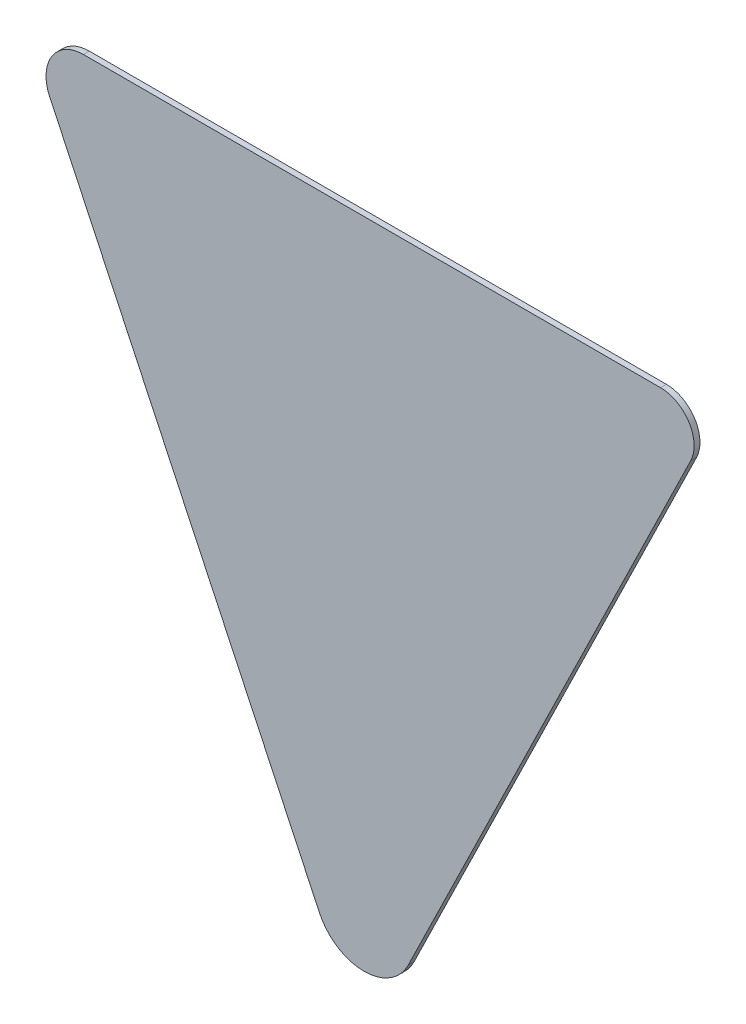
ISO-10303-21;
HEADER;
FILE_DESCRIPTION(('STEP AP214'),'2;1');
FILE_NAME('part.step','',(''),(''),'','','');
FILE_SCHEMA(('AUTOMOTIVE_DESIGN { 1 0 10303 214 1 1 1 1 }'));
ENDSEC;
DATA;
#1=APPLICATION_CONTEXT('core data for automotive mechanical design processes');
#2=APPLICATION_PROTOCOL_DEFINITION('international standard','automotive_design',2000,#1);
#3=PRODUCT_CONTEXT('',#1,'mechanical');
#4=PRODUCT('Part','Part','',(#3));
#5=PRODUCT_RELATED_PRODUCT_CATEGORY('part','',(#4));
#6=PRODUCT_DEFINITION_FORMATION('','',#4);
#7=PRODUCT_DEFINITION_CONTEXT('part definition',#1,'design');
#8=PRODUCT_DEFINITION('design','',#6,#7);
#9=PRODUCT_DEFINITION_SHAPE('','',#8);
#10=(LENGTH_UNIT() NAMED_UNIT(*) SI_UNIT(.MILLI.,.METRE.));
#11=(NAMED_UNIT(*) PLANE_ANGLE_UNIT() SI_UNIT($,.RADIAN.));
#12=(NAMED_UNIT(*) SI_UNIT($,.STERADIAN.) SOLID_ANGLE_UNIT());
#13=UNCERTAINTY_MEASURE_WITH_UNIT(LENGTH_MEASURE(1.E-05),#10,'distance_accuracy_value','');
#14=(GEOMETRIC_REPRESENTATION_CONTEXT(3) GLOBAL_UNCERTAINTY_ASSIGNED_CONTEXT((#13)) GLOBAL_UNIT_ASSIGNED_CONTEXT((#10,
#11,#12)) REPRESENTATION_CONTEXT('',''));
#15=CARTESIAN_POINT('',(0.,0.,0.));
#16=DIRECTION('',(0.,0.,1.));
#17=DIRECTION('',(1.,0.,0.));
#18=AXIS2_PLACEMENT_3D('',#15,#16,#17);
#19=CARTESIAN_POINT('',(2.477599435213,-20.5069220502,0.01));
#20=DIRECTION('',(0.,0.,1.));
#21=DIRECTION('',(1.,0.,0.));
#22=AXIS2_PLACEMENT_3D('',#19,#20,#21);
#23=PLANE('',#22);
#24=DIRECTION('',(-0.439074920177975,-0.898450451872948,0.));
#25=VECTOR('',#24,1.);
#26=CARTESIAN_POINT('',(3.029041627363,-20.17938889386,0.01));
#27=LINE('',#26,#25);
#28=CARTESIAN_POINT('',(3.029041627363,-20.17938889386,0.01));
#29=VERTEX_POINT('',#28);
#30=CARTESIAN_POINT('',(2.546015783423,-21.16777326247,0.01));
#31=VERTEX_POINT('',#30);
#32=EDGE_CURVE('E106',#29,#31,#27,.T.);
#33=ORIENTED_EDGE('',*,*,#32,.F.);
#34=CARTESIAN_POINT('',(2.977511126464,-20.15420581279,0.01));
#35=DIRECTION('',(0.,0.,1.));
#36=DIRECTION('',(1.,0.,0.));
#37=AXIS2_PLACEMENT_3D('',#34,#35,#36);
#38=CIRCLE('',#37,0.05735486112931);
#39=CARTESIAN_POINT('',(2.977511126464,-20.09685095166,0.01));
#40=VERTEX_POINT('',#39);
#41=EDGE_CURVE('E11',#29,#40,#38,.T.);
#42=ORIENTED_EDGE('',*,*,#41,.T.);
#43=DIRECTION('',(1.,0.,0.));
#44=VECTOR('',#43,1.);
#45=CARTESIAN_POINT('',(1.990216038403,-20.09685095166,0.01));
#46=LINE('',#45,#44);
#47=CARTESIAN_POINT('',(1.990216038403,-20.09685095166,0.01));
#48=VERTEX_POINT('',#47);
#49=EDGE_CURVE('E120',#48,#40,#46,.T.);
#50=ORIENTED_EDGE('',*,*,#49,.F.);
#51=CARTESIAN_POINT('',(1.990216038403,-20.16077809461,0.01));
#52=DIRECTION('',(0.,0.,1.));
#53=DIRECTION('',(1.,0.,0.));
#54=AXIS2_PLACEMENT_3D('',#51,#52,#53);
#55=CIRCLE('',#54,0.06392714294668);
#56=CARTESIAN_POINT('',(1.932400868686,-20.18805602994,0.01));
#57=VERTEX_POINT('',#56);
#58=EDGE_CURVE('E117',#48,#57,#55,.T.);
#59=ORIENTED_EDGE('',*,*,#58,.T.);
#60=DIRECTION('',(-0.426703495172115,0.904391578470245,0.));
#61=VECTOR('',#60,1.);
#62=CARTESIAN_POINT('',(2.394152286364,-21.16673114795,0.01));
#63=LINE('',#62,#61);
#64=CARTESIAN_POINT('',(2.394152286364,-21.16673114795,0.01));
#65=VERTEX_POINT('',#64);
#66=EDGE_CURVE('E136',#65,#57,#63,.T.);
#67=ORIENTED_EDGE('',*,*,#66,.F.);
#68=CARTESIAN_POINT('',(2.470334262103,-21.13078751901,0.01));
#69=DIRECTION('',(0.,0.,1.));
#70=DIRECTION('',(1.,0.,0.));
#71=AXIS2_PLACEMENT_3D('',#68,#69,#70);
#72=CIRCLE('',#71,0.0842356093896);
#73=EDGE_CURVE('E131',#65,#31,#72,.T.);
#74=ORIENTED_EDGE('',*,*,#73,.T.);
#75=EDGE_LOOP('',(#33,#42,#50,#59,#67,#74));
#76=FACE_BOUND('',#75,.T.);
#77=ADVANCED_FACE('F17',(#76),#23,.T.);
#78=CARTESIAN_POINT('',(2.477599435213,-20.5069220502,0.));
#79=DIRECTION('',(0.,0.,1.));
#80=DIRECTION('',(1.,0.,0.));
#81=AXIS2_PLACEMENT_3D('',#78,#79,#80);
#82=PLANE('',#81);
#83=DIRECTION('',(-0.439074920177975,-0.898450451872948,0.));
#84=VECTOR('',#83,1.);
#85=CARTESIAN_POINT('',(3.029041627363,-20.17938889386,0.));
#86=LINE('',#85,#84);
#87=CARTESIAN_POINT('',(3.029041627363,-20.17938889386,0.));
#88=VERTEX_POINT('',#87);
#89=CARTESIAN_POINT('',(2.546015783423,-21.16777326247,0.));
#90=VERTEX_POINT('',#89);
#91=EDGE_CURVE('E87',#88,#90,#86,.T.);
#92=ORIENTED_EDGE('',*,*,#91,.T.);
#93=CARTESIAN_POINT('',(2.470334262103,-21.13078751901,0.));
#94=DIRECTION('',(0.,0.,1.));
#95=DIRECTION('',(1.,0.,0.));
#96=AXIS2_PLACEMENT_3D('',#93,#94,#95);
#97=CIRCLE('',#96,0.0842356093896);
#98=CARTESIAN_POINT('',(2.394152286364,-21.16673114795,0.));
#99=VERTEX_POINT('',#98);
#100=EDGE_CURVE('E125',#99,#90,#97,.T.);
#101=ORIENTED_EDGE('',*,*,#100,.F.);
#102=DIRECTION('',(-0.426703495172115,0.904391578470245,0.));
#103=VECTOR('',#102,1.);
#104=CARTESIAN_POINT('',(2.394152286364,-21.16673114795,0.));
#105=LINE('',#104,#103);
#106=CARTESIAN_POINT('',(1.932400868686,-20.18805602994,0.));
#107=VERTEX_POINT('',#106);
#108=EDGE_CURVE('E115',#99,#107,#105,.T.);
#109=ORIENTED_EDGE('',*,*,#108,.T.);
#110=CARTESIAN_POINT('',(1.990216038403,-20.16077809461,0.));
#111=DIRECTION('',(0.,0.,1.));
#112=DIRECTION('',(1.,0.,0.));
#113=AXIS2_PLACEMENT_3D('',#110,#111,#112);
#114=CIRCLE('',#113,0.06392714294668);
#115=CARTESIAN_POINT('',(1.990216038403,-20.09685095166,0.));
#116=VERTEX_POINT('',#115);
#117=EDGE_CURVE('E121',#116,#107,#114,.T.);
#118=ORIENTED_EDGE('',*,*,#117,.F.);
#119=DIRECTION('',(1.,0.,0.));
#120=VECTOR('',#119,1.);
#121=CARTESIAN_POINT('',(1.990216038403,-20.09685095166,0.));
#122=LINE('',#121,#120);
#123=CARTESIAN_POINT('',(2.977511126464,-20.09685095166,0.));
#124=VERTEX_POINT('',#123);
#125=EDGE_CURVE('E90',#116,#124,#122,.T.);
#126=ORIENTED_EDGE('',*,*,#125,.T.);
#127=CARTESIAN_POINT('',(2.977511126464,-20.15420581279,0.));
#128=DIRECTION('',(0.,0.,1.));
#129=DIRECTION('',(1.,0.,0.));
#130=AXIS2_PLACEMENT_3D('',#127,#128,#129);
#131=CIRCLE('',#130,0.05735486112931);
#132=EDGE_CURVE('E25',#88,#124,#131,.T.);
#133=ORIENTED_EDGE('',*,*,#132,.F.);
#134=EDGE_LOOP('',(#92,#101,#109,#118,#126,#133));
#135=FACE_BOUND('',#134,.T.);
#136=ADVANCED_FACE('F85',(#135),#82,.F.);
#137=CARTESIAN_POINT('',(2.977511126464,-20.15420581279,0.));
#138=DIRECTION('',(0.,0.,-1.));
#139=DIRECTION('',(1.,0.,0.));
#140=AXIS2_PLACEMENT_3D('',#137,#138,#139);
#141=CYLINDRICAL_SURFACE('',#140,0.05735486112931);
#142=DIRECTION('',(0.,0.,1.));
#143=VECTOR('',#142,1.);
#144=CARTESIAN_POINT('',(3.029041627363,-20.17938889386,0.));
#145=LINE('',#144,#143);
#146=EDGE_CURVE('E98',#88,#29,#145,.T.);
#147=ORIENTED_EDGE('',*,*,#146,.F.);
#148=ORIENTED_EDGE('',*,*,#132,.T.);
#149=DIRECTION('',(0.,0.,1.));
#150=VECTOR('',#149,1.);
#151=CARTESIAN_POINT('',(2.977511126464,-20.09685095166,0.));
#152=LINE('',#151,#150);
#153=EDGE_CURVE('E142',#124,#40,#152,.T.);
#154=ORIENTED_EDGE('',*,*,#153,.T.);
#155=ORIENTED_EDGE('',*,*,#41,.F.);
#156=EDGE_LOOP('',(#147,#148,#154,#155));
#157=FACE_BOUND('',#156,.T.);
#158=ADVANCED_FACE('F104',(#157),#141,.T.);
#159=CARTESIAN_POINT('',(1.990216038403,-20.09685095166,0.));
#160=DIRECTION('',(0.,1.,0.));
#161=DIRECTION('',(1.,0.,0.));
#162=AXIS2_PLACEMENT_3D('',#159,#160,#161);
#163=PLANE('',#162);
#164=DIRECTION('',(0.,0.,1.));
#165=VECTOR('',#164,1.);
#166=CARTESIAN_POINT('',(1.990216038403,-20.09685095166,0.));
#167=LINE('',#166,#165);
#168=EDGE_CURVE('E128',#116,#48,#167,.T.);
#169=ORIENTED_EDGE('',*,*,#168,.T.);
#170=ORIENTED_EDGE('',*,*,#49,.T.);
#171=ORIENTED_EDGE('',*,*,#153,.F.);
#172=ORIENTED_EDGE('',*,*,#125,.F.);
#173=EDGE_LOOP('',(#169,#170,#171,#172));
#174=FACE_BOUND('',#173,.T.);
#175=ADVANCED_FACE('F153',(#174),#163,.T.);
#176=CARTESIAN_POINT('',(1.990216038403,-20.16077809461,0.));
#177=DIRECTION('',(0.,0.,-1.));
#178=DIRECTION('',(-0.844601531832609,0.535395416889246,0.));
#179=AXIS2_PLACEMENT_3D('',#176,#177,#178);
#180=CYLINDRICAL_SURFACE('',#179,0.06392714294668);
#181=ORIENTED_EDGE('',*,*,#168,.F.);
#182=ORIENTED_EDGE('',*,*,#117,.T.);
#183=DIRECTION('',(0.,0.,1.));
#184=VECTOR('',#183,1.);
#185=CARTESIAN_POINT('',(1.932400868686,-20.18805602994,0.));
#186=LINE('',#185,#184);
#187=EDGE_CURVE('E132',#107,#57,#186,.T.);
#188=ORIENTED_EDGE('',*,*,#187,.T.);
#189=ORIENTED_EDGE('',*,*,#58,.F.);
#190=EDGE_LOOP('',(#181,#182,#188,#189));
#191=FACE_BOUND('',#190,.T.);
#192=ADVANCED_FACE('F157',(#191),#180,.T.);
#193=CARTESIAN_POINT('',(2.394152286364,-21.16673114795,0.));
#194=DIRECTION('',(-0.904391578470245,-0.426703495172115,0.));
#195=DIRECTION('',(-0.426703495172115,0.904391578470245,0.));
#196=AXIS2_PLACEMENT_3D('',#193,#194,#195);
#197=PLANE('',#196);
#198=DIRECTION('',(0.,0.,1.));
#199=VECTOR('',#198,1.);
#200=CARTESIAN_POINT('',(2.394152286364,-21.16673114795,0.));
#201=LINE('',#200,#199);
#202=EDGE_CURVE('E102',#99,#65,#201,.T.);
#203=ORIENTED_EDGE('',*,*,#202,.T.);
#204=ORIENTED_EDGE('',*,*,#66,.T.);
#205=ORIENTED_EDGE('',*,*,#187,.F.);
#206=ORIENTED_EDGE('',*,*,#108,.F.);
#207=EDGE_LOOP('',(#203,#204,#205,#206));
#208=FACE_BOUND('',#207,.T.);
#209=ADVANCED_FACE('F161',(#208),#197,.T.);
#210=CARTESIAN_POINT('',(2.470334262103,-21.13078751901,0.));
#211=DIRECTION('',(0.,0.,-1.));
#212=DIRECTION('',(1.,0.,0.));
#213=AXIS2_PLACEMENT_3D('',#210,#211,#212);
#214=CYLINDRICAL_SURFACE('',#213,0.0842356093896);
#215=ORIENTED_EDGE('',*,*,#202,.F.);
#216=ORIENTED_EDGE('',*,*,#100,.T.);
#217=DIRECTION('',(0.,0.,1.));
#218=VECTOR('',#217,1.);
#219=CARTESIAN_POINT('',(2.546015783423,-21.16777326247,0.));
#220=LINE('',#219,#218);
#221=EDGE_CURVE('E100',#90,#31,#220,.T.);
#222=ORIENTED_EDGE('',*,*,#221,.T.);
#223=ORIENTED_EDGE('',*,*,#73,.F.);
#224=EDGE_LOOP('',(#215,#216,#222,#223));
#225=FACE_BOUND('',#224,.T.);
#226=ADVANCED_FACE('F165',(#225),#214,.T.);
#227=CARTESIAN_POINT('',(3.029041627363,-20.17938889386,0.));
#228=DIRECTION('',(0.898450451872948,-0.439074920177975,0.));
#229=DIRECTION('',(0.,0.,-1.));
#230=AXIS2_PLACEMENT_3D('',#227,#228,#229);
#231=PLANE('',#230);
#232=ORIENTED_EDGE('',*,*,#146,.T.);
#233=ORIENTED_EDGE('',*,*,#32,.T.);
#234=ORIENTED_EDGE('',*,*,#221,.F.);
#235=ORIENTED_EDGE('',*,*,#91,.F.);
#236=EDGE_LOOP('',(#232,#233,#234,#235));
#237=FACE_BOUND('',#236,.T.);
#238=ADVANCED_FACE('F96',(#237),#231,.T.);
#239=CLOSED_SHELL('',(#77,#136,#158,#175,#192,#209,#226,#238));
#240=MANIFOLD_SOLID_BREP('B1',#239);
#241=ADVANCED_BREP_SHAPE_REPRESENTATION('',(#18,#240),#14);
#242=SHAPE_DEFINITION_REPRESENTATION(#9,#241);
ENDSEC;
END-ISO-10303-21;
